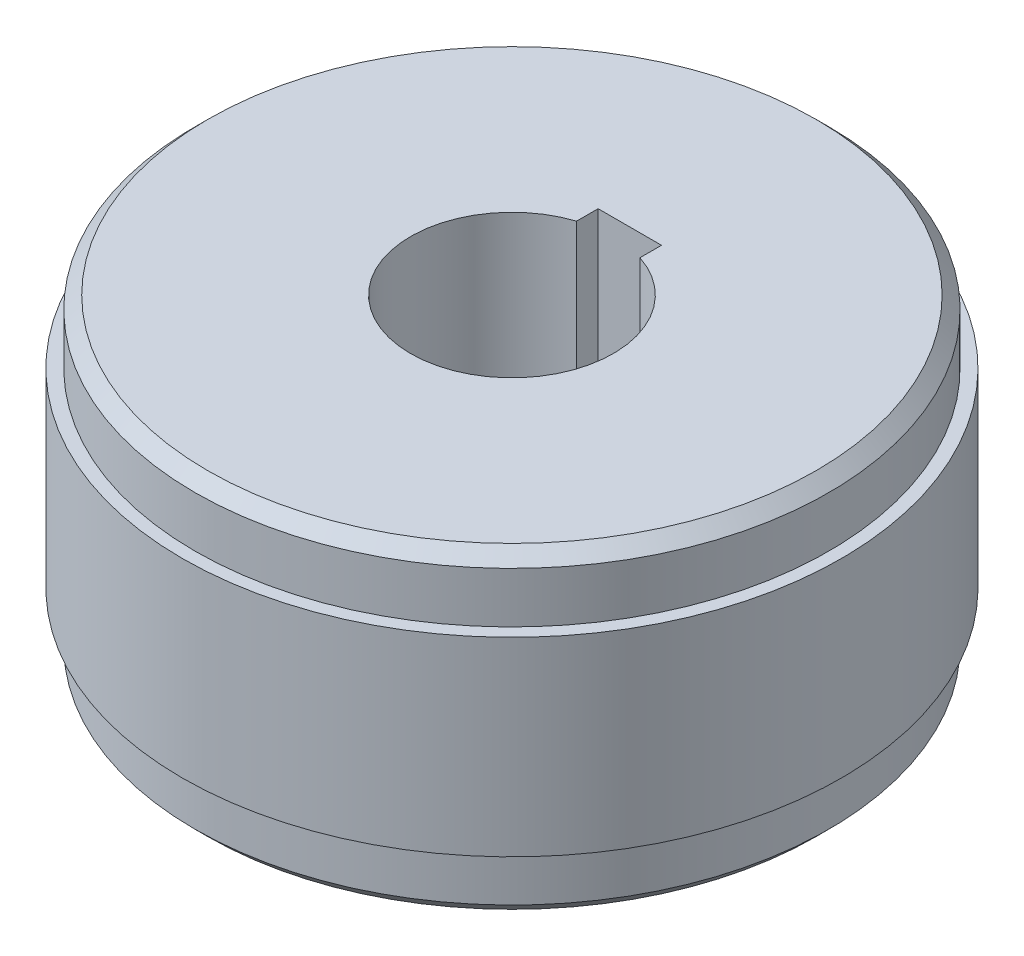
ISO-10303-21;
HEADER;
FILE_DESCRIPTION(('STEP AP214'),'2;1');
FILE_NAME('part.step','',(''),(''),'','','');
FILE_SCHEMA(('AUTOMOTIVE_DESIGN { 1 0 10303 214 1 1 1 1 }'));
ENDSEC;
DATA;
#1=APPLICATION_CONTEXT('core data for automotive mechanical design processes');
#2=APPLICATION_PROTOCOL_DEFINITION('international standard','automotive_design',2000,#1);
#3=PRODUCT_CONTEXT('',#1,'mechanical');
#4=PRODUCT('Part','Part','',(#3));
#5=PRODUCT_RELATED_PRODUCT_CATEGORY('part','',(#4));
#6=PRODUCT_DEFINITION_FORMATION('','',#4);
#7=PRODUCT_DEFINITION_CONTEXT('part definition',#1,'design');
#8=PRODUCT_DEFINITION('design','',#6,#7);
#9=PRODUCT_DEFINITION_SHAPE('','',#8);
#10=(LENGTH_UNIT() NAMED_UNIT(*) SI_UNIT(.MILLI.,.METRE.));
#11=(NAMED_UNIT(*) PLANE_ANGLE_UNIT() SI_UNIT($,.RADIAN.));
#12=(NAMED_UNIT(*) SI_UNIT($,.STERADIAN.) SOLID_ANGLE_UNIT());
#13=UNCERTAINTY_MEASURE_WITH_UNIT(LENGTH_MEASURE(1.E-05),#10,'distance_accuracy_value','');
#14=(GEOMETRIC_REPRESENTATION_CONTEXT(3) GLOBAL_UNCERTAINTY_ASSIGNED_CONTEXT((#13)) GLOBAL_UNIT_ASSIGNED_CONTEXT((#10,
#11,#12)) REPRESENTATION_CONTEXT('',''));
#15=CARTESIAN_POINT('',(0.,0.,0.));
#16=DIRECTION('',(0.,0.,1.));
#17=DIRECTION('',(1.,0.,0.));
#18=AXIS2_PLACEMENT_3D('',#15,#16,#17);
#19=CARTESIAN_POINT('',(0.,12.5,0.));
#20=DIRECTION('',(0.,-1.,0.));
#21=DIRECTION('',(0.,0.,-1.));
#22=AXIS2_PLACEMENT_3D('',#19,#20,#21);
#23=CYLINDRICAL_SURFACE('',#22,25.);
#24=CARTESIAN_POINT('',(0.,-11.5,0.));
#25=DIRECTION('',(0.,1.,0.));
#26=DIRECTION('',(0.,0.,1.));
#27=AXIS2_PLACEMENT_3D('',#24,#25,#26);
#28=CIRCLE('',#27,25.);
#29=CARTESIAN_POINT('',(0.,-11.5,25.));
#30=VERTEX_POINT('',#29);
#31=EDGE_CURVE('E49',#30,#30,#28,.T.);
#32=ORIENTED_EDGE('',*,*,#31,.T.);
#33=EDGE_LOOP('',(#32));
#34=FACE_BOUND('',#33,.T.);
#35=CARTESIAN_POINT('',(0.,-7.5,0.));
#36=DIRECTION('',(0.,1.,0.));
#37=DIRECTION('',(0.,0.,1.));
#38=AXIS2_PLACEMENT_3D('',#35,#36,#37);
#39=CIRCLE('',#38,25.);
#40=CARTESIAN_POINT('',(0.,-7.5,25.));
#41=VERTEX_POINT('',#40);
#42=EDGE_CURVE('E98',#41,#41,#39,.T.);
#43=ORIENTED_EDGE('',*,*,#42,.F.);
#44=EDGE_LOOP('',(#43));
#45=FACE_BOUND('',#44,.T.);
#46=ADVANCED_FACE('F40',(#34,#45),#23,.T.);
#47=CARTESIAN_POINT('',(0.,12.5,0.));
#48=DIRECTION('',(0.,1.,0.));
#49=DIRECTION('',(0.,0.,1.));
#50=AXIS2_PLACEMENT_3D('',#47,#48,#49);
#51=PLANE('',#50);
#52=CARTESIAN_POINT('',(0.,12.5,0.));
#53=DIRECTION('',(0.,1.,0.));
#54=DIRECTION('',(0.,0.,1.));
#55=AXIS2_PLACEMENT_3D('',#52,#53,#54);
#56=CIRCLE('',#55,24.);
#57=CARTESIAN_POINT('',(0.,12.5,24.));
#58=VERTEX_POINT('',#57);
#59=EDGE_CURVE('E123',#58,#58,#56,.T.);
#60=ORIENTED_EDGE('',*,*,#59,.T.);
#61=EDGE_LOOP('',(#60));
#62=FACE_BOUND('',#61,.T.);
#63=DIRECTION('',(0.,0.,-1.));
#64=VECTOR('',#63,1.);
#65=CARTESIAN_POINT('',(2.50000000000001,12.5,-9.3));
#66=LINE('',#65,#64);
#67=CARTESIAN_POINT('',(2.50000000000001,12.5,-7.59934207678533));
#68=VERTEX_POINT('',#67);
#69=CARTESIAN_POINT('',(2.50000000000001,12.5,-9.3));
#70=VERTEX_POINT('',#69);
#71=EDGE_CURVE('E90',#68,#70,#66,.T.);
#72=ORIENTED_EDGE('',*,*,#71,.F.);
#73=CARTESIAN_POINT('',(0.,12.5,0.));
#74=DIRECTION('',(0.,1.,0.));
#75=DIRECTION('',(0.,0.,1.));
#76=AXIS2_PLACEMENT_3D('',#73,#74,#75);
#77=CIRCLE('',#76,8.);
#78=CARTESIAN_POINT('',(-2.49999999999999,12.5,-7.59934207678533));
#79=VERTEX_POINT('',#78);
#80=EDGE_CURVE('E82',#79,#68,#77,.T.);
#81=ORIENTED_EDGE('',*,*,#80,.F.);
#82=DIRECTION('',(0.,0.,1.));
#83=VECTOR('',#82,1.);
#84=CARTESIAN_POINT('',(-2.49999999999999,12.5,-7.59934207678533));
#85=LINE('',#84,#83);
#86=CARTESIAN_POINT('',(-2.49999999999999,12.5,-9.3));
#87=VERTEX_POINT('',#86);
#88=EDGE_CURVE('E105',#87,#79,#85,.T.);
#89=ORIENTED_EDGE('',*,*,#88,.F.);
#90=DIRECTION('',(-1.,0.,0.));
#91=VECTOR('',#90,1.);
#92=CARTESIAN_POINT('',(-2.49999999999999,12.5,-9.3));
#93=LINE('',#92,#91);
#94=EDGE_CURVE('E103',#70,#87,#93,.T.);
#95=ORIENTED_EDGE('',*,*,#94,.F.);
#96=EDGE_LOOP('',(#72,#81,#89,#95));
#97=FACE_BOUND('',#96,.T.);
#98=ADVANCED_FACE('F102',(#62,#97),#51,.T.);
#99=CARTESIAN_POINT('',(0.,-12.5,0.));
#100=DIRECTION('',(0.,1.,0.));
#101=DIRECTION('',(0.,0.,1.));
#102=AXIS2_PLACEMENT_3D('',#99,#100,#101);
#103=PLANE('',#102);
#104=CARTESIAN_POINT('',(0.,-12.5,0.));
#105=DIRECTION('',(0.,1.,0.));
#106=DIRECTION('',(0.,0.,1.));
#107=AXIS2_PLACEMENT_3D('',#104,#105,#106);
#108=CIRCLE('',#107,24.);
#109=CARTESIAN_POINT('',(0.,-12.5,24.));
#110=VERTEX_POINT('',#109);
#111=EDGE_CURVE('E11',#110,#110,#108,.F.);
#112=ORIENTED_EDGE('',*,*,#111,.T.);
#113=EDGE_LOOP('',(#112));
#114=FACE_BOUND('',#113,.T.);
#115=CARTESIAN_POINT('',(0.,-12.5,0.));
#116=DIRECTION('',(0.,1.,0.));
#117=DIRECTION('',(0.,0.,1.));
#118=AXIS2_PLACEMENT_3D('',#115,#116,#117);
#119=CIRCLE('',#118,8.);
#120=CARTESIAN_POINT('',(-2.49999999999999,-12.5,-7.59934207678533));
#121=VERTEX_POINT('',#120);
#122=CARTESIAN_POINT('',(2.50000000000001,-12.5,-7.59934207678533));
#123=VERTEX_POINT('',#122);
#124=EDGE_CURVE('E64',#121,#123,#119,.T.);
#125=ORIENTED_EDGE('',*,*,#124,.T.);
#126=DIRECTION('',(0.,0.,-1.));
#127=VECTOR('',#126,1.);
#128=CARTESIAN_POINT('',(2.50000000000001,-12.5,-9.3));
#129=LINE('',#128,#127);
#130=CARTESIAN_POINT('',(2.50000000000001,-12.5,-9.3));
#131=VERTEX_POINT('',#130);
#132=EDGE_CURVE('E97',#123,#131,#129,.T.);
#133=ORIENTED_EDGE('',*,*,#132,.T.);
#134=DIRECTION('',(-1.,0.,0.));
#135=VECTOR('',#134,1.);
#136=CARTESIAN_POINT('',(-2.49999999999999,-12.5,-9.3));
#137=LINE('',#136,#135);
#138=CARTESIAN_POINT('',(-2.49999999999999,-12.5,-9.3));
#139=VERTEX_POINT('',#138);
#140=EDGE_CURVE('E113',#131,#139,#137,.T.);
#141=ORIENTED_EDGE('',*,*,#140,.T.);
#142=DIRECTION('',(0.,0.,1.));
#143=VECTOR('',#142,1.);
#144=CARTESIAN_POINT('',(-2.49999999999999,-12.5,-7.59934207678533));
#145=LINE('',#144,#143);
#146=EDGE_CURVE('E91',#139,#121,#145,.T.);
#147=ORIENTED_EDGE('',*,*,#146,.T.);
#148=EDGE_LOOP('',(#125,#133,#141,#147));
#149=FACE_BOUND('',#148,.T.);
#150=ADVANCED_FACE('F151',(#114,#149),#103,.F.);
#151=CARTESIAN_POINT('',(0.,11.5,0.));
#152=DIRECTION('',(0.,1.,0.));
#153=DIRECTION('',(0.,0.,1.));
#154=AXIS2_PLACEMENT_3D('',#151,#152,#153);
#155=CIRCLE('',#154,25.);
#156=CARTESIAN_POINT('',(0.,11.5,25.));
#157=VERTEX_POINT('',#156);
#158=EDGE_CURVE('E129',#157,#157,#155,.F.);
#159=ORIENTED_EDGE('',*,*,#158,.T.);
#160=EDGE_LOOP('',(#159));
#161=FACE_BOUND('',#160,.T.);
#162=CARTESIAN_POINT('',(0.,7.5,0.));
#163=DIRECTION('',(0.,1.,0.));
#164=DIRECTION('',(0.,0.,1.));
#165=AXIS2_PLACEMENT_3D('',#162,#163,#164);
#166=CIRCLE('',#165,25.);
#167=CARTESIAN_POINT('',(0.,7.5,25.));
#168=VERTEX_POINT('',#167);
#169=EDGE_CURVE('E111',#168,#168,#166,.T.);
#170=ORIENTED_EDGE('',*,*,#169,.T.);
#171=EDGE_LOOP('',(#170));
#172=FACE_BOUND('',#171,.T.);
#173=ADVANCED_FACE('F147',(#161,#172),#23,.T.);
#174=CARTESIAN_POINT('',(0.,12.5,0.));
#175=DIRECTION('',(0.,-1.,0.));
#176=DIRECTION('',(0.,0.,-1.));
#177=AXIS2_PLACEMENT_3D('',#174,#175,#176);
#178=CYLINDRICAL_SURFACE('',#177,8.);
#179=ORIENTED_EDGE('',*,*,#124,.F.);
#180=DIRECTION('',(0.,-1.,0.));
#181=VECTOR('',#180,1.);
#182=CARTESIAN_POINT('',(-2.49999999999999,12.5,-7.59934207678533));
#183=LINE('',#182,#181);
#184=EDGE_CURVE('E86',#79,#121,#183,.T.);
#185=ORIENTED_EDGE('',*,*,#184,.F.);
#186=ORIENTED_EDGE('',*,*,#80,.T.);
#187=DIRECTION('',(0.,-1.,0.));
#188=VECTOR('',#187,1.);
#189=CARTESIAN_POINT('',(2.50000000000001,12.5,-7.59934207678533));
#190=LINE('',#189,#188);
#191=EDGE_CURVE('E85',#68,#123,#190,.T.);
#192=ORIENTED_EDGE('',*,*,#191,.T.);
#193=EDGE_LOOP('',(#179,#185,#186,#192));
#194=FACE_BOUND('',#193,.T.);
#195=ADVANCED_FACE('F84',(#194),#178,.F.);
#196=CARTESIAN_POINT('',(2.50000000000001,12.5,-9.3));
#197=DIRECTION('',(-1.,0.,0.));
#198=DIRECTION('',(0.,0.,1.));
#199=AXIS2_PLACEMENT_3D('',#196,#197,#198);
#200=PLANE('',#199);
#201=ORIENTED_EDGE('',*,*,#132,.F.);
#202=ORIENTED_EDGE('',*,*,#191,.F.);
#203=ORIENTED_EDGE('',*,*,#71,.T.);
#204=DIRECTION('',(0.,-1.,0.));
#205=VECTOR('',#204,1.);
#206=CARTESIAN_POINT('',(2.50000000000001,12.5,-9.3));
#207=LINE('',#206,#205);
#208=EDGE_CURVE('E99',#70,#131,#207,.T.);
#209=ORIENTED_EDGE('',*,*,#208,.T.);
#210=EDGE_LOOP('',(#201,#202,#203,#209));
#211=FACE_BOUND('',#210,.T.);
#212=ADVANCED_FACE('F94',(#211),#200,.T.);
#213=CARTESIAN_POINT('',(-2.49999999999999,12.5,-9.3));
#214=DIRECTION('',(0.,0.,1.));
#215=DIRECTION('',(1.,0.,0.));
#216=AXIS2_PLACEMENT_3D('',#213,#214,#215);
#217=PLANE('',#216);
#218=ORIENTED_EDGE('',*,*,#140,.F.);
#219=ORIENTED_EDGE('',*,*,#208,.F.);
#220=ORIENTED_EDGE('',*,*,#94,.T.);
#221=DIRECTION('',(0.,-1.,0.));
#222=VECTOR('',#221,1.);
#223=CARTESIAN_POINT('',(-2.49999999999999,12.5,-9.3));
#224=LINE('',#223,#222);
#225=EDGE_CURVE('E56',#87,#139,#224,.T.);
#226=ORIENTED_EDGE('',*,*,#225,.T.);
#227=EDGE_LOOP('',(#218,#219,#220,#226));
#228=FACE_BOUND('',#227,.T.);
#229=ADVANCED_FACE('F192',(#228),#217,.T.);
#230=CARTESIAN_POINT('',(-2.49999999999999,12.5,-7.59934207678533));
#231=DIRECTION('',(1.,0.,0.));
#232=DIRECTION('',(0.,0.,-1.));
#233=AXIS2_PLACEMENT_3D('',#230,#231,#232);
#234=PLANE('',#233);
#235=ORIENTED_EDGE('',*,*,#146,.F.);
#236=ORIENTED_EDGE('',*,*,#225,.F.);
#237=ORIENTED_EDGE('',*,*,#88,.T.);
#238=ORIENTED_EDGE('',*,*,#184,.T.);
#239=EDGE_LOOP('',(#235,#236,#237,#238));
#240=FACE_BOUND('',#239,.T.);
#241=ADVANCED_FACE('F171',(#240),#234,.T.);
#242=CARTESIAN_POINT('',(0.,7.5,0.));
#243=DIRECTION('',(0.,1.,0.));
#244=DIRECTION('',(0.,0.,1.));
#245=AXIS2_PLACEMENT_3D('',#242,#243,#244);
#246=PLANE('',#245);
#247=ORIENTED_EDGE('',*,*,#169,.F.);
#248=EDGE_LOOP('',(#247));
#249=FACE_BOUND('',#248,.T.);
#250=CARTESIAN_POINT('',(0.,7.5,0.));
#251=DIRECTION('',(0.,1.,0.));
#252=DIRECTION('',(0.,0.,1.));
#253=AXIS2_PLACEMENT_3D('',#250,#251,#252);
#254=CIRCLE('',#253,26.);
#255=CARTESIAN_POINT('',(0.,7.5,26.));
#256=VERTEX_POINT('',#255);
#257=EDGE_CURVE('E126',#256,#256,#254,.T.);
#258=ORIENTED_EDGE('',*,*,#257,.T.);
#259=EDGE_LOOP('',(#258));
#260=FACE_BOUND('',#259,.T.);
#261=ADVANCED_FACE('F167',(#249,#260),#246,.T.);
#262=CARTESIAN_POINT('',(0.,-7.5,0.));
#263=DIRECTION('',(0.,1.,0.));
#264=DIRECTION('',(0.,0.,1.));
#265=AXIS2_PLACEMENT_3D('',#262,#263,#264);
#266=PLANE('',#265);
#267=ORIENTED_EDGE('',*,*,#42,.T.);
#268=EDGE_LOOP('',(#267));
#269=FACE_BOUND('',#268,.T.);
#270=CARTESIAN_POINT('',(0.,-7.5,0.));
#271=DIRECTION('',(0.,1.,0.));
#272=DIRECTION('',(0.,0.,1.));
#273=AXIS2_PLACEMENT_3D('',#270,#271,#272);
#274=CIRCLE('',#273,26.);
#275=CARTESIAN_POINT('',(0.,-7.5,26.));
#276=VERTEX_POINT('',#275);
#277=EDGE_CURVE('E176',#276,#276,#274,.T.);
#278=ORIENTED_EDGE('',*,*,#277,.F.);
#279=EDGE_LOOP('',(#278));
#280=FACE_BOUND('',#279,.T.);
#281=ADVANCED_FACE('F170',(#269,#280),#266,.F.);
#282=CARTESIAN_POINT('',(0.,7.5,0.));
#283=DIRECTION('',(0.,-1.,0.));
#284=DIRECTION('',(0.,0.,-1.));
#285=AXIS2_PLACEMENT_3D('',#282,#283,#284);
#286=CYLINDRICAL_SURFACE('',#285,26.);
#287=ORIENTED_EDGE('',*,*,#257,.F.);
#288=EDGE_LOOP('',(#287));
#289=FACE_BOUND('',#288,.T.);
#290=ORIENTED_EDGE('',*,*,#277,.T.);
#291=EDGE_LOOP('',(#290));
#292=FACE_BOUND('',#291,.T.);
#293=ADVANCED_FACE('F142',(#289,#292),#286,.T.);
#294=CARTESIAN_POINT('',(0.,12.5,0.));
#295=DIRECTION('',(0.,-1.,0.));
#296=DIRECTION('',(0.,0.,-1.));
#297=AXIS2_PLACEMENT_3D('',#294,#295,#296);
#298=CONICAL_SURFACE('',#297,24.,0.785398163397447);
#299=ORIENTED_EDGE('',*,*,#158,.F.);
#300=EDGE_LOOP('',(#299));
#301=FACE_BOUND('',#300,.T.);
#302=ORIENTED_EDGE('',*,*,#59,.F.);
#303=EDGE_LOOP('',(#302));
#304=FACE_BOUND('',#303,.T.);
#305=ADVANCED_FACE('F137',(#301,#304),#298,.T.);
#306=CARTESIAN_POINT('',(0.,-11.5,0.));
#307=DIRECTION('',(0.,1.,0.));
#308=DIRECTION('',(0.,0.,1.));
#309=AXIS2_PLACEMENT_3D('',#306,#307,#308);
#310=CONICAL_SURFACE('',#309,25.,0.785398163397452);
#311=ORIENTED_EDGE('',*,*,#111,.F.);
#312=EDGE_LOOP('',(#311));
#313=FACE_BOUND('',#312,.T.);
#314=ORIENTED_EDGE('',*,*,#31,.F.);
#315=EDGE_LOOP('',(#314));
#316=FACE_BOUND('',#315,.T.);
#317=ADVANCED_FACE('F43',(#313,#316),#310,.T.);
#318=CLOSED_SHELL('',(#46,#98,#150,#173,#195,#212,#229,#241,#261,#281,#293,#305,#317));
#319=MANIFOLD_SOLID_BREP('B2',#318);
#320=ADVANCED_BREP_SHAPE_REPRESENTATION('',(#18,#319),#14);
#321=SHAPE_DEFINITION_REPRESENTATION(#9,#320);
ENDSEC;
END-ISO-10303-21;
